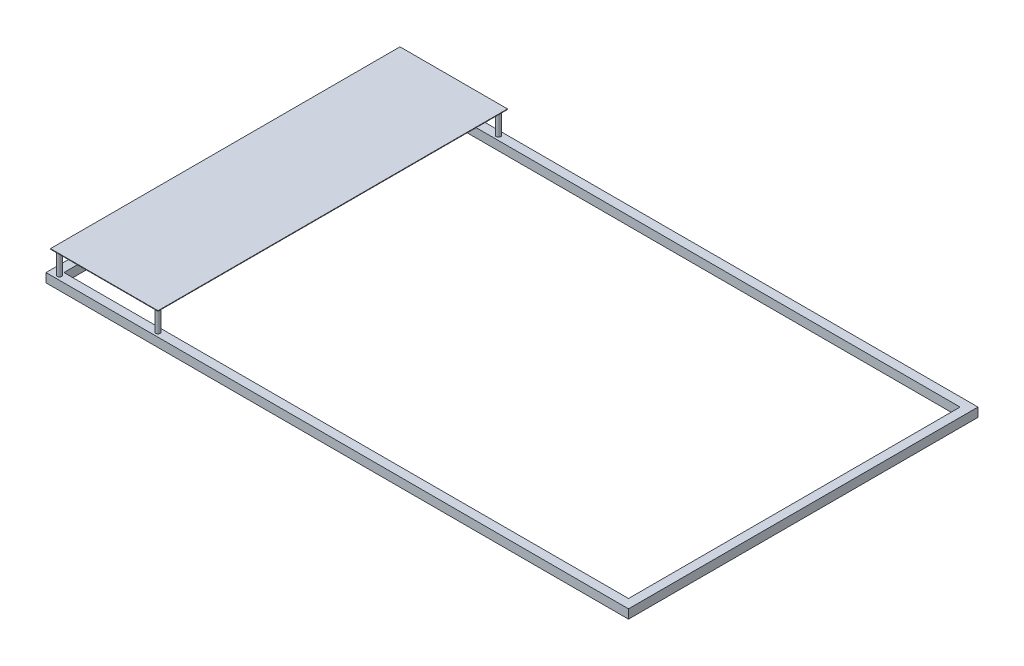
ISO-10303-21;
HEADER;
FILE_DESCRIPTION(('STEP AP214'),'2;1');
FILE_NAME('part.step','',(''),(''),'','','');
FILE_SCHEMA(('AUTOMOTIVE_DESIGN { 1 0 10303 214 1 1 1 1 }'));
ENDSEC;
DATA;
#1=APPLICATION_CONTEXT('core data for automotive mechanical design processes');
#2=APPLICATION_PROTOCOL_DEFINITION('international standard','automotive_design',2000,#1);
#3=PRODUCT_CONTEXT('',#1,'mechanical');
#4=PRODUCT('Part','Part','',(#3));
#5=PRODUCT_RELATED_PRODUCT_CATEGORY('part','',(#4));
#6=PRODUCT_DEFINITION_FORMATION('','',#4);
#7=PRODUCT_DEFINITION_CONTEXT('part definition',#1,'design');
#8=PRODUCT_DEFINITION('design','',#6,#7);
#9=PRODUCT_DEFINITION_SHAPE('','',#8);
#10=(LENGTH_UNIT() NAMED_UNIT(*) SI_UNIT(.MILLI.,.METRE.));
#11=(NAMED_UNIT(*) PLANE_ANGLE_UNIT() SI_UNIT($,.RADIAN.));
#12=(NAMED_UNIT(*) SI_UNIT($,.STERADIAN.) SOLID_ANGLE_UNIT());
#13=UNCERTAINTY_MEASURE_WITH_UNIT(LENGTH_MEASURE(1.E-05),#10,'distance_accuracy_value','');
#14=(GEOMETRIC_REPRESENTATION_CONTEXT(3) GLOBAL_UNCERTAINTY_ASSIGNED_CONTEXT((#13)) GLOBAL_UNIT_ASSIGNED_CONTEXT((#10,
#11,#12)) REPRESENTATION_CONTEXT('',''));
#15=CARTESIAN_POINT('',(0.,0.,0.));
#16=DIRECTION('',(0.,0.,1.));
#17=DIRECTION('',(1.,0.,0.));
#18=AXIS2_PLACEMENT_3D('',#15,#16,#17);
#19=CARTESIAN_POINT('',(-825.5,0.,-495.3));
#20=DIRECTION('',(0.,1.,0.));
#21=DIRECTION('',(1.,0.,0.));
#22=AXIS2_PLACEMENT_3D('',#19,#20,#21);
#23=PLANE('',#22);
#24=DIRECTION('',(1.,0.,0.));
#25=VECTOR('',#24,1.);
#26=CARTESIAN_POINT('',(-1625.6,0.,-965.2));
#27=LINE('',#26,#25);
#28=CARTESIAN_POINT('',(-1625.6,0.,-965.2));
#29=VERTEX_POINT('',#28);
#30=CARTESIAN_POINT('',(-25.4,0.,-965.2));
#31=VERTEX_POINT('',#30);
#32=EDGE_CURVE('E138',#29,#31,#27,.T.);
#33=ORIENTED_EDGE('',*,*,#32,.F.);
#34=DIRECTION('',(0.,0.,-1.));
#35=VECTOR('',#34,1.);
#36=CARTESIAN_POINT('',(-1625.6,0.,-25.4));
#37=LINE('',#36,#35);
#38=CARTESIAN_POINT('',(-1625.6,0.,-25.4));
#39=VERTEX_POINT('',#38);
#40=EDGE_CURVE('E155',#39,#29,#37,.T.);
#41=ORIENTED_EDGE('',*,*,#40,.F.);
#42=DIRECTION('',(-1.,0.,0.));
#43=VECTOR('',#42,1.);
#44=CARTESIAN_POINT('',(-25.4,0.,-25.4));
#45=LINE('',#44,#43);
#46=CARTESIAN_POINT('',(-25.4,0.,-25.4));
#47=VERTEX_POINT('',#46);
#48=EDGE_CURVE('E136',#47,#39,#45,.T.);
#49=ORIENTED_EDGE('',*,*,#48,.F.);
#50=DIRECTION('',(0.,0.,1.));
#51=VECTOR('',#50,1.);
#52=CARTESIAN_POINT('',(-25.4,0.,-965.2));
#53=LINE('',#52,#51);
#54=EDGE_CURVE('E182',#31,#47,#53,.T.);
#55=ORIENTED_EDGE('',*,*,#54,.F.);
#56=EDGE_LOOP('',(#33,#41,#49,#55));
#57=FACE_BOUND('',#56,.T.);
#58=DIRECTION('',(0.,0.,1.));
#59=VECTOR('',#58,1.);
#60=CARTESIAN_POINT('',(-1651.,0.,-990.6));
#61=LINE('',#60,#59);
#62=CARTESIAN_POINT('',(-1651.,0.,-990.6));
#63=VERTEX_POINT('',#62);
#64=CARTESIAN_POINT('',(-1651.,0.,0.));
#65=VERTEX_POINT('',#64);
#66=EDGE_CURVE('E56',#63,#65,#61,.T.);
#67=ORIENTED_EDGE('',*,*,#66,.F.);
#68=DIRECTION('',(-1.,0.,0.));
#69=VECTOR('',#68,1.);
#70=CARTESIAN_POINT('',(0.,0.,-990.6));
#71=LINE('',#70,#69);
#72=CARTESIAN_POINT('',(0.,0.,-990.6));
#73=VERTEX_POINT('',#72);
#74=EDGE_CURVE('E128',#73,#63,#71,.T.);
#75=ORIENTED_EDGE('',*,*,#74,.F.);
#76=DIRECTION('',(0.,0.,-1.));
#77=VECTOR('',#76,1.);
#78=CARTESIAN_POINT('',(0.,0.,0.));
#79=LINE('',#78,#77);
#80=CARTESIAN_POINT('',(0.,0.,0.));
#81=VERTEX_POINT('',#80);
#82=EDGE_CURVE('E142',#81,#73,#79,.T.);
#83=ORIENTED_EDGE('',*,*,#82,.F.);
#84=DIRECTION('',(1.,0.,0.));
#85=VECTOR('',#84,1.);
#86=CARTESIAN_POINT('',(-1651.,0.,0.));
#87=LINE('',#86,#85);
#88=EDGE_CURVE('E145',#65,#81,#87,.T.);
#89=ORIENTED_EDGE('',*,*,#88,.F.);
#90=EDGE_LOOP('',(#67,#75,#83,#89));
#91=FACE_BOUND('',#90,.T.);
#92=ADVANCED_FACE('F46',(#57,#91),#23,.F.);
#93=CARTESIAN_POINT('',(-825.5,25.4,-495.3));
#94=DIRECTION('',(0.,1.,0.));
#95=DIRECTION('',(1.,0.,0.));
#96=AXIS2_PLACEMENT_3D('',#93,#94,#95);
#97=PLANE('',#96);
#98=CARTESIAN_POINT('',(-1625.60000000001,25.4,-12.6999999999999));
#99=DIRECTION('',(0.,1.,0.));
#100=DIRECTION('',(0.,0.,-1.));
#101=AXIS2_PLACEMENT_3D('',#98,#99,#100);
#102=CIRCLE('',#101,6.35000000000019);
#103=CARTESIAN_POINT('',(-1625.60000000001,25.4,-19.0500000000001));
#104=VERTEX_POINT('',#103);
#105=EDGE_CURVE('E210',#104,#104,#102,.T.);
#106=ORIENTED_EDGE('',*,*,#105,.F.);
#107=EDGE_LOOP('',(#106));
#108=FACE_BOUND('',#107,.T.);
#109=CARTESIAN_POINT('',(-1346.20000000001,25.4,-12.6999999999963));
#110=DIRECTION('',(0.,1.,0.));
#111=DIRECTION('',(0.,0.,-1.));
#112=AXIS2_PLACEMENT_3D('',#109,#110,#111);
#113=CIRCLE('',#112,6.35000000000019);
#114=CARTESIAN_POINT('',(-1346.20000000001,25.4,-19.0499999999965));
#115=VERTEX_POINT('',#114);
#116=EDGE_CURVE('E204',#115,#115,#113,.T.);
#117=ORIENTED_EDGE('',*,*,#116,.F.);
#118=EDGE_LOOP('',(#117));
#119=FACE_BOUND('',#118,.T.);
#120=CARTESIAN_POINT('',(-1346.2,25.4,-977.9));
#121=DIRECTION('',(0.,1.,0.));
#122=DIRECTION('',(0.,0.,1.));
#123=AXIS2_PLACEMENT_3D('',#120,#121,#122);
#124=CIRCLE('',#123,6.35000000000015);
#125=CARTESIAN_POINT('',(-1346.2,25.4,-971.55));
#126=VERTEX_POINT('',#125);
#127=EDGE_CURVE('E198',#126,#126,#124,.T.);
#128=ORIENTED_EDGE('',*,*,#127,.F.);
#129=EDGE_LOOP('',(#128));
#130=FACE_BOUND('',#129,.T.);
#131=CARTESIAN_POINT('',(-1625.6,25.4,-977.9));
#132=DIRECTION('',(0.,1.,0.));
#133=DIRECTION('',(0.,0.,1.));
#134=AXIS2_PLACEMENT_3D('',#131,#132,#133);
#135=CIRCLE('',#134,6.35000000000015);
#136=CARTESIAN_POINT('',(-1625.6,25.4,-971.55));
#137=VERTEX_POINT('',#136);
#138=EDGE_CURVE('E176',#137,#137,#135,.T.);
#139=ORIENTED_EDGE('',*,*,#138,.F.);
#140=EDGE_LOOP('',(#139));
#141=FACE_BOUND('',#140,.T.);
#142=DIRECTION('',(1.,0.,0.));
#143=VECTOR('',#142,1.);
#144=CARTESIAN_POINT('',(-1625.6,25.4,-965.2));
#145=LINE('',#144,#143);
#146=CARTESIAN_POINT('',(-1625.6,25.4,-965.2));
#147=VERTEX_POINT('',#146);
#148=CARTESIAN_POINT('',(-25.4,25.4,-965.2));
#149=VERTEX_POINT('',#148);
#150=EDGE_CURVE('E130',#147,#149,#145,.T.);
#151=ORIENTED_EDGE('',*,*,#150,.T.);
#152=DIRECTION('',(0.,0.,1.));
#153=VECTOR('',#152,1.);
#154=CARTESIAN_POINT('',(-25.4,25.4,-965.2));
#155=LINE('',#154,#153);
#156=CARTESIAN_POINT('',(-25.4,25.4,-25.4));
#157=VERTEX_POINT('',#156);
#158=EDGE_CURVE('E50',#149,#157,#155,.T.);
#159=ORIENTED_EDGE('',*,*,#158,.T.);
#160=DIRECTION('',(-1.,0.,0.));
#161=VECTOR('',#160,1.);
#162=CARTESIAN_POINT('',(-25.4,25.4,-25.4));
#163=LINE('',#162,#161);
#164=CARTESIAN_POINT('',(-1625.6,25.4,-25.4));
#165=VERTEX_POINT('',#164);
#166=EDGE_CURVE('E148',#157,#165,#163,.T.);
#167=ORIENTED_EDGE('',*,*,#166,.T.);
#168=DIRECTION('',(0.,0.,-1.));
#169=VECTOR('',#168,1.);
#170=CARTESIAN_POINT('',(-1625.6,25.4,-25.4));
#171=LINE('',#170,#169);
#172=EDGE_CURVE('E137',#165,#147,#171,.T.);
#173=ORIENTED_EDGE('',*,*,#172,.T.);
#174=EDGE_LOOP('',(#151,#159,#167,#173));
#175=FACE_BOUND('',#174,.T.);
#176=DIRECTION('',(-1.,0.,0.));
#177=VECTOR('',#176,1.);
#178=CARTESIAN_POINT('',(0.,25.4,-990.6));
#179=LINE('',#178,#177);
#180=CARTESIAN_POINT('',(0.,25.4,-990.6));
#181=VERTEX_POINT('',#180);
#182=CARTESIAN_POINT('',(-1651.,25.4,-990.6));
#183=VERTEX_POINT('',#182);
#184=EDGE_CURVE('E108',#181,#183,#179,.T.);
#185=ORIENTED_EDGE('',*,*,#184,.T.);
#186=DIRECTION('',(0.,0.,1.));
#187=VECTOR('',#186,1.);
#188=CARTESIAN_POINT('',(-1651.,25.4,-990.6));
#189=LINE('',#188,#187);
#190=CARTESIAN_POINT('',(-1651.,25.4,0.));
#191=VERTEX_POINT('',#190);
#192=EDGE_CURVE('E11',#183,#191,#189,.T.);
#193=ORIENTED_EDGE('',*,*,#192,.T.);
#194=DIRECTION('',(1.,0.,0.));
#195=VECTOR('',#194,1.);
#196=CARTESIAN_POINT('',(-1651.,25.4,0.));
#197=LINE('',#196,#195);
#198=CARTESIAN_POINT('',(0.,25.4,0.));
#199=VERTEX_POINT('',#198);
#200=EDGE_CURVE('E147',#191,#199,#197,.T.);
#201=ORIENTED_EDGE('',*,*,#200,.T.);
#202=DIRECTION('',(0.,0.,-1.));
#203=VECTOR('',#202,1.);
#204=CARTESIAN_POINT('',(0.,25.4,0.));
#205=LINE('',#204,#203);
#206=EDGE_CURVE('E111',#199,#181,#205,.T.);
#207=ORIENTED_EDGE('',*,*,#206,.T.);
#208=EDGE_LOOP('',(#185,#193,#201,#207));
#209=FACE_BOUND('',#208,.T.);
#210=ADVANCED_FACE('F109',(#108,#119,#130,#141,#175,#209),#97,.T.);
#211=CARTESIAN_POINT('',(-1651.,0.,-990.6));
#212=DIRECTION('',(-1.,0.,0.));
#213=DIRECTION('',(0.,0.,1.));
#214=AXIS2_PLACEMENT_3D('',#211,#212,#213);
#215=PLANE('',#214);
#216=ORIENTED_EDGE('',*,*,#66,.T.);
#217=DIRECTION('',(0.,1.,0.));
#218=VECTOR('',#217,1.);
#219=CARTESIAN_POINT('',(-1651.,0.,0.));
#220=LINE('',#219,#218);
#221=EDGE_CURVE('E124',#65,#191,#220,.T.);
#222=ORIENTED_EDGE('',*,*,#221,.T.);
#223=ORIENTED_EDGE('',*,*,#192,.F.);
#224=DIRECTION('',(0.,1.,0.));
#225=VECTOR('',#224,1.);
#226=CARTESIAN_POINT('',(-1651.,0.,-990.6));
#227=LINE('',#226,#225);
#228=EDGE_CURVE('E117',#63,#183,#227,.T.);
#229=ORIENTED_EDGE('',*,*,#228,.F.);
#230=EDGE_LOOP('',(#216,#222,#223,#229));
#231=FACE_BOUND('',#230,.T.);
#232=ADVANCED_FACE('F121',(#231),#215,.T.);
#233=CARTESIAN_POINT('',(-1651.,0.,0.));
#234=DIRECTION('',(0.,0.,1.));
#235=DIRECTION('',(1.,0.,0.));
#236=AXIS2_PLACEMENT_3D('',#233,#234,#235);
#237=PLANE('',#236);
#238=ORIENTED_EDGE('',*,*,#88,.T.);
#239=DIRECTION('',(0.,1.,0.));
#240=VECTOR('',#239,1.);
#241=CARTESIAN_POINT('',(0.,0.,0.));
#242=LINE('',#241,#240);
#243=EDGE_CURVE('E143',#81,#199,#242,.T.);
#244=ORIENTED_EDGE('',*,*,#243,.T.);
#245=ORIENTED_EDGE('',*,*,#200,.F.);
#246=ORIENTED_EDGE('',*,*,#221,.F.);
#247=EDGE_LOOP('',(#238,#244,#245,#246));
#248=FACE_BOUND('',#247,.T.);
#249=ADVANCED_FACE('F308',(#248),#237,.T.);
#250=CARTESIAN_POINT('',(0.,0.,0.));
#251=DIRECTION('',(1.,0.,0.));
#252=DIRECTION('',(0.,1.,0.));
#253=AXIS2_PLACEMENT_3D('',#250,#251,#252);
#254=PLANE('',#253);
#255=ORIENTED_EDGE('',*,*,#82,.T.);
#256=DIRECTION('',(0.,1.,0.));
#257=VECTOR('',#256,1.);
#258=CARTESIAN_POINT('',(0.,0.,-990.6));
#259=LINE('',#258,#257);
#260=EDGE_CURVE('E116',#73,#181,#259,.T.);
#261=ORIENTED_EDGE('',*,*,#260,.T.);
#262=ORIENTED_EDGE('',*,*,#206,.F.);
#263=ORIENTED_EDGE('',*,*,#243,.F.);
#264=EDGE_LOOP('',(#255,#261,#262,#263));
#265=FACE_BOUND('',#264,.T.);
#266=ADVANCED_FACE('F305',(#265),#254,.T.);
#267=CARTESIAN_POINT('',(0.,0.,-990.6));
#268=DIRECTION('',(0.,0.,-1.));
#269=DIRECTION('',(0.,-1.,0.));
#270=AXIS2_PLACEMENT_3D('',#267,#268,#269);
#271=PLANE('',#270);
#272=ORIENTED_EDGE('',*,*,#74,.T.);
#273=ORIENTED_EDGE('',*,*,#228,.T.);
#274=ORIENTED_EDGE('',*,*,#184,.F.);
#275=ORIENTED_EDGE('',*,*,#260,.F.);
#276=EDGE_LOOP('',(#272,#273,#274,#275));
#277=FACE_BOUND('',#276,.T.);
#278=ADVANCED_FACE('F126',(#277),#271,.T.);
#279=CARTESIAN_POINT('',(-1625.6,0.,-965.2));
#280=DIRECTION('',(0.,0.,1.));
#281=DIRECTION('',(1.,0.,0.));
#282=AXIS2_PLACEMENT_3D('',#279,#280,#281);
#283=PLANE('',#282);
#284=ORIENTED_EDGE('',*,*,#32,.T.);
#285=DIRECTION('',(0.,1.,0.));
#286=VECTOR('',#285,1.);
#287=CARTESIAN_POINT('',(-25.4,0.,-965.2));
#288=LINE('',#287,#286);
#289=EDGE_CURVE('E140',#31,#149,#288,.T.);
#290=ORIENTED_EDGE('',*,*,#289,.T.);
#291=ORIENTED_EDGE('',*,*,#150,.F.);
#292=DIRECTION('',(0.,1.,0.));
#293=VECTOR('',#292,1.);
#294=CARTESIAN_POINT('',(-1625.6,0.,-965.2));
#295=LINE('',#294,#293);
#296=EDGE_CURVE('E152',#29,#147,#295,.T.);
#297=ORIENTED_EDGE('',*,*,#296,.F.);
#298=EDGE_LOOP('',(#284,#290,#291,#297));
#299=FACE_BOUND('',#298,.T.);
#300=ADVANCED_FACE('F190',(#299),#283,.T.);
#301=CARTESIAN_POINT('',(-25.4,0.,-965.2));
#302=DIRECTION('',(-1.,0.,0.));
#303=DIRECTION('',(0.,0.,1.));
#304=AXIS2_PLACEMENT_3D('',#301,#302,#303);
#305=PLANE('',#304);
#306=ORIENTED_EDGE('',*,*,#54,.T.);
#307=DIRECTION('',(0.,1.,0.));
#308=VECTOR('',#307,1.);
#309=CARTESIAN_POINT('',(-25.4,0.,-25.4));
#310=LINE('',#309,#308);
#311=EDGE_CURVE('E150',#47,#157,#310,.T.);
#312=ORIENTED_EDGE('',*,*,#311,.T.);
#313=ORIENTED_EDGE('',*,*,#158,.F.);
#314=ORIENTED_EDGE('',*,*,#289,.F.);
#315=EDGE_LOOP('',(#306,#312,#313,#314));
#316=FACE_BOUND('',#315,.T.);
#317=ADVANCED_FACE('F304',(#316),#305,.T.);
#318=CARTESIAN_POINT('',(-25.4,0.,-25.4));
#319=DIRECTION('',(0.,0.,-1.));
#320=DIRECTION('',(0.,-1.,0.));
#321=AXIS2_PLACEMENT_3D('',#318,#319,#320);
#322=PLANE('',#321);
#323=ORIENTED_EDGE('',*,*,#48,.T.);
#324=DIRECTION('',(0.,1.,0.));
#325=VECTOR('',#324,1.);
#326=CARTESIAN_POINT('',(-1625.6,0.,-25.4));
#327=LINE('',#326,#325);
#328=EDGE_CURVE('E133',#39,#165,#327,.T.);
#329=ORIENTED_EDGE('',*,*,#328,.T.);
#330=ORIENTED_EDGE('',*,*,#166,.F.);
#331=ORIENTED_EDGE('',*,*,#311,.F.);
#332=EDGE_LOOP('',(#323,#329,#330,#331));
#333=FACE_BOUND('',#332,.T.);
#334=ADVANCED_FACE('F161',(#333),#322,.T.);
#335=CARTESIAN_POINT('',(-1625.6,0.,-25.4));
#336=DIRECTION('',(1.,0.,0.));
#337=DIRECTION('',(0.,1.,0.));
#338=AXIS2_PLACEMENT_3D('',#335,#336,#337);
#339=PLANE('',#338);
#340=ORIENTED_EDGE('',*,*,#40,.T.);
#341=ORIENTED_EDGE('',*,*,#296,.T.);
#342=ORIENTED_EDGE('',*,*,#172,.F.);
#343=ORIENTED_EDGE('',*,*,#328,.F.);
#344=EDGE_LOOP('',(#340,#341,#342,#343));
#345=FACE_BOUND('',#344,.T.);
#346=ADVANCED_FACE('F48',(#345),#339,.T.);
#347=CARTESIAN_POINT('',(-1625.6,88.9,-977.9));
#348=DIRECTION('',(0.,-1.,0.));
#349=DIRECTION('',(0.,0.,-1.));
#350=AXIS2_PLACEMENT_3D('',#347,#348,#349);
#351=CYLINDRICAL_SURFACE('',#350,6.35000000000015);
#352=CARTESIAN_POINT('',(-1625.6,88.9,-977.9));
#353=DIRECTION('',(0.,1.,0.));
#354=DIRECTION('',(0.,0.,1.));
#355=AXIS2_PLACEMENT_3D('',#352,#353,#354);
#356=CIRCLE('',#355,6.35000000000015);
#357=CARTESIAN_POINT('',(-1625.6,88.9,-971.55));
#358=VERTEX_POINT('',#357);
#359=EDGE_CURVE('E173',#358,#358,#356,.T.);
#360=ORIENTED_EDGE('',*,*,#359,.F.);
#361=EDGE_LOOP('',(#360));
#362=FACE_BOUND('',#361,.T.);
#363=ORIENTED_EDGE('',*,*,#138,.T.);
#364=EDGE_LOOP('',(#363));
#365=FACE_BOUND('',#364,.T.);
#366=ADVANCED_FACE('F299',(#362,#365),#351,.T.);
#367=CARTESIAN_POINT('',(-1346.2,88.9,-977.9));
#368=DIRECTION('',(0.,-1.,0.));
#369=DIRECTION('',(0.,0.,-1.));
#370=AXIS2_PLACEMENT_3D('',#367,#368,#369);
#371=CYLINDRICAL_SURFACE('',#370,6.35000000000015);
#372=CARTESIAN_POINT('',(-1346.2,88.9,-977.9));
#373=DIRECTION('',(0.,1.,0.));
#374=DIRECTION('',(0.,0.,1.));
#375=AXIS2_PLACEMENT_3D('',#372,#373,#374);
#376=CIRCLE('',#375,6.35000000000015);
#377=CARTESIAN_POINT('',(-1346.2,88.9,-971.55));
#378=VERTEX_POINT('',#377);
#379=EDGE_CURVE('E196',#378,#378,#376,.T.);
#380=ORIENTED_EDGE('',*,*,#379,.F.);
#381=EDGE_LOOP('',(#380));
#382=FACE_BOUND('',#381,.T.);
#383=ORIENTED_EDGE('',*,*,#127,.T.);
#384=EDGE_LOOP('',(#383));
#385=FACE_BOUND('',#384,.T.);
#386=ADVANCED_FACE('F349',(#382,#385),#371,.T.);
#387=CARTESIAN_POINT('',(-1346.20000000001,88.9,-12.6999999999963));
#388=DIRECTION('',(0.,-1.,0.));
#389=DIRECTION('',(0.,0.,-1.));
#390=AXIS2_PLACEMENT_3D('',#387,#388,#389);
#391=CYLINDRICAL_SURFACE('',#390,6.35000000000019);
#392=CARTESIAN_POINT('',(-1346.20000000001,88.9,-12.6999999999963));
#393=DIRECTION('',(0.,1.,0.));
#394=DIRECTION('',(0.,0.,-1.));
#395=AXIS2_PLACEMENT_3D('',#392,#393,#394);
#396=CIRCLE('',#395,6.35000000000019);
#397=CARTESIAN_POINT('',(-1346.20000000001,88.9,-19.0499999999965));
#398=VERTEX_POINT('',#397);
#399=EDGE_CURVE('E201',#398,#398,#396,.T.);
#400=ORIENTED_EDGE('',*,*,#399,.F.);
#401=EDGE_LOOP('',(#400));
#402=FACE_BOUND('',#401,.T.);
#403=ORIENTED_EDGE('',*,*,#116,.T.);
#404=EDGE_LOOP('',(#403));
#405=FACE_BOUND('',#404,.T.);
#406=ADVANCED_FACE('F356',(#402,#405),#391,.T.);
#407=CARTESIAN_POINT('',(-1625.60000000001,88.9,-12.6999999999999));
#408=DIRECTION('',(0.,-1.,0.));
#409=DIRECTION('',(0.,0.,-1.));
#410=AXIS2_PLACEMENT_3D('',#407,#408,#409);
#411=CYLINDRICAL_SURFACE('',#410,6.35000000000019);
#412=CARTESIAN_POINT('',(-1625.60000000001,88.9,-12.6999999999999));
#413=DIRECTION('',(0.,1.,0.));
#414=DIRECTION('',(0.,0.,-1.));
#415=AXIS2_PLACEMENT_3D('',#412,#413,#414);
#416=CIRCLE('',#415,6.35000000000019);
#417=CARTESIAN_POINT('',(-1625.60000000001,88.9,-19.0500000000001));
#418=VERTEX_POINT('',#417);
#419=EDGE_CURVE('E207',#418,#418,#416,.T.);
#420=ORIENTED_EDGE('',*,*,#419,.F.);
#421=EDGE_LOOP('',(#420));
#422=FACE_BOUND('',#421,.T.);
#423=ORIENTED_EDGE('',*,*,#105,.T.);
#424=EDGE_LOOP('',(#423));
#425=FACE_BOUND('',#424,.T.);
#426=ADVANCED_FACE('F363',(#422,#425),#411,.T.);
#427=CARTESIAN_POINT('',(-1638.3,90.4875,-990.6));
#428=DIRECTION('',(1.,0.,0.));
#429=DIRECTION('',(0.,0.,-1.));
#430=AXIS2_PLACEMENT_3D('',#427,#428,#429);
#431=PLANE('',#430);
#432=DIRECTION('',(0.,0.,1.));
#433=VECTOR('',#432,1.);
#434=CARTESIAN_POINT('',(-1638.3,88.9,-990.6));
#435=LINE('',#434,#433);
#436=CARTESIAN_POINT('',(-1638.3,88.9,-990.6));
#437=VERTEX_POINT('',#436);
#438=CARTESIAN_POINT('',(-1638.3,88.9,-1.11022302462516E-13));
#439=VERTEX_POINT('',#438);
#440=EDGE_CURVE('E238',#437,#439,#435,.T.);
#441=ORIENTED_EDGE('',*,*,#440,.T.);
#442=DIRECTION('',(0.,-1.,0.));
#443=VECTOR('',#442,1.);
#444=CARTESIAN_POINT('',(-1638.3,90.4875,-1.11022302462516E-13));
#445=LINE('',#444,#443);
#446=CARTESIAN_POINT('',(-1638.3,90.4875,-1.11022302462516E-13));
#447=VERTEX_POINT('',#446);
#448=EDGE_CURVE('E213',#447,#439,#445,.T.);
#449=ORIENTED_EDGE('',*,*,#448,.F.);
#450=DIRECTION('',(0.,0.,1.));
#451=VECTOR('',#450,1.);
#452=CARTESIAN_POINT('',(-1638.3,90.4875,-990.6));
#453=LINE('',#452,#451);
#454=CARTESIAN_POINT('',(-1638.3,90.4875,-990.6));
#455=VERTEX_POINT('',#454);
#456=EDGE_CURVE('E231',#455,#447,#453,.T.);
#457=ORIENTED_EDGE('',*,*,#456,.F.);
#458=DIRECTION('',(0.,-1.,0.));
#459=VECTOR('',#458,1.);
#460=CARTESIAN_POINT('',(-1638.3,90.4875,-990.6));
#461=LINE('',#460,#459);
#462=EDGE_CURVE('E224',#455,#437,#461,.T.);
#463=ORIENTED_EDGE('',*,*,#462,.T.);
#464=EDGE_LOOP('',(#441,#449,#457,#463));
#465=FACE_BOUND('',#464,.T.);
#466=ADVANCED_FACE('F262',(#465),#431,.F.);
#467=CARTESIAN_POINT('',(-1638.3,90.4875,-1.11022302462516E-13));
#468=DIRECTION('',(0.,0.,-1.));
#469=DIRECTION('',(-1.,0.,0.));
#470=AXIS2_PLACEMENT_3D('',#467,#468,#469);
#471=PLANE('',#470);
#472=DIRECTION('',(1.,0.,0.));
#473=VECTOR('',#472,1.);
#474=CARTESIAN_POINT('',(-1638.3,88.9,-1.11022302462516E-13));
#475=LINE('',#474,#473);
#476=CARTESIAN_POINT('',(-1333.5,88.9,-1.11022302462516E-13));
#477=VERTEX_POINT('',#476);
#478=EDGE_CURVE('E235',#439,#477,#475,.T.);
#479=ORIENTED_EDGE('',*,*,#478,.T.);
#480=DIRECTION('',(0.,-1.,0.));
#481=VECTOR('',#480,1.);
#482=CARTESIAN_POINT('',(-1333.5,90.4875,-1.11022302462516E-13));
#483=LINE('',#482,#481);
#484=CARTESIAN_POINT('',(-1333.5,90.4875,-1.11022302462516E-13));
#485=VERTEX_POINT('',#484);
#486=EDGE_CURVE('E218',#485,#477,#483,.T.);
#487=ORIENTED_EDGE('',*,*,#486,.F.);
#488=DIRECTION('',(1.,0.,0.));
#489=VECTOR('',#488,1.);
#490=CARTESIAN_POINT('',(-1638.3,90.4875,-1.11022302462516E-13));
#491=LINE('',#490,#489);
#492=EDGE_CURVE('E246',#447,#485,#491,.T.);
#493=ORIENTED_EDGE('',*,*,#492,.F.);
#494=ORIENTED_EDGE('',*,*,#448,.T.);
#495=EDGE_LOOP('',(#479,#487,#493,#494));
#496=FACE_BOUND('',#495,.T.);
#497=ADVANCED_FACE('F266',(#496),#471,.F.);
#498=CARTESIAN_POINT('',(-1333.5,90.4875,-990.6));
#499=DIRECTION('',(-1.,0.,0.));
#500=DIRECTION('',(0.,0.,1.));
#501=AXIS2_PLACEMENT_3D('',#498,#499,#500);
#502=PLANE('',#501);
#503=DIRECTION('',(0.,0.,-1.));
#504=VECTOR('',#503,1.);
#505=CARTESIAN_POINT('',(-1333.5,88.9,-990.6));
#506=LINE('',#505,#504);
#507=CARTESIAN_POINT('',(-1333.5,88.9,-990.6));
#508=VERTEX_POINT('',#507);
#509=EDGE_CURVE('E232',#477,#508,#506,.T.);
#510=ORIENTED_EDGE('',*,*,#509,.T.);
#511=DIRECTION('',(0.,-1.,0.));
#512=VECTOR('',#511,1.);
#513=CARTESIAN_POINT('',(-1333.5,90.4875,-990.6));
#514=LINE('',#513,#512);
#515=CARTESIAN_POINT('',(-1333.5,90.4875,-990.6));
#516=VERTEX_POINT('',#515);
#517=EDGE_CURVE('E221',#516,#508,#514,.T.);
#518=ORIENTED_EDGE('',*,*,#517,.F.);
#519=DIRECTION('',(0.,0.,-1.));
#520=VECTOR('',#519,1.);
#521=CARTESIAN_POINT('',(-1333.5,90.4875,-990.6));
#522=LINE('',#521,#520);
#523=EDGE_CURVE('E243',#485,#516,#522,.T.);
#524=ORIENTED_EDGE('',*,*,#523,.F.);
#525=ORIENTED_EDGE('',*,*,#486,.T.);
#526=EDGE_LOOP('',(#510,#518,#524,#525));
#527=FACE_BOUND('',#526,.T.);
#528=ADVANCED_FACE('F384',(#527),#502,.F.);
#529=CARTESIAN_POINT('',(-1638.3,90.4875,-990.6));
#530=DIRECTION('',(0.,0.,1.));
#531=DIRECTION('',(1.,0.,0.));
#532=AXIS2_PLACEMENT_3D('',#529,#530,#531);
#533=PLANE('',#532);
#534=DIRECTION('',(-1.,0.,0.));
#535=VECTOR('',#534,1.);
#536=CARTESIAN_POINT('',(-1638.3,88.9,-990.6));
#537=LINE('',#536,#535);
#538=EDGE_CURVE('E228',#508,#437,#537,.T.);
#539=ORIENTED_EDGE('',*,*,#538,.T.);
#540=ORIENTED_EDGE('',*,*,#462,.F.);
#541=DIRECTION('',(-1.,0.,0.));
#542=VECTOR('',#541,1.);
#543=CARTESIAN_POINT('',(-1638.3,90.4875,-990.6));
#544=LINE('',#543,#542);
#545=EDGE_CURVE('E227',#516,#455,#544,.T.);
#546=ORIENTED_EDGE('',*,*,#545,.F.);
#547=ORIENTED_EDGE('',*,*,#517,.T.);
#548=EDGE_LOOP('',(#539,#540,#546,#547));
#549=FACE_BOUND('',#548,.T.);
#550=ADVANCED_FACE('F280',(#549),#533,.F.);
#551=CARTESIAN_POINT('',(0.,90.4875,0.));
#552=DIRECTION('',(0.,1.,0.));
#553=DIRECTION('',(0.,0.,1.));
#554=AXIS2_PLACEMENT_3D('',#551,#552,#553);
#555=PLANE('',#554);
#556=ORIENTED_EDGE('',*,*,#456,.T.);
#557=ORIENTED_EDGE('',*,*,#492,.T.);
#558=ORIENTED_EDGE('',*,*,#523,.T.);
#559=ORIENTED_EDGE('',*,*,#545,.T.);
#560=EDGE_LOOP('',(#556,#557,#558,#559));
#561=FACE_BOUND('',#560,.T.);
#562=ADVANCED_FACE('F254',(#561),#555,.T.);
#563=CARTESIAN_POINT('',(0.,88.9,0.));
#564=DIRECTION('',(0.,1.,0.));
#565=DIRECTION('',(0.,0.,1.));
#566=AXIS2_PLACEMENT_3D('',#563,#564,#565);
#567=PLANE('',#566);
#568=ORIENTED_EDGE('',*,*,#359,.T.);
#569=EDGE_LOOP('',(#568));
#570=FACE_BOUND('',#569,.T.);
#571=ORIENTED_EDGE('',*,*,#379,.T.);
#572=EDGE_LOOP('',(#571));
#573=FACE_BOUND('',#572,.T.);
#574=ORIENTED_EDGE('',*,*,#399,.T.);
#575=EDGE_LOOP('',(#574));
#576=FACE_BOUND('',#575,.T.);
#577=ORIENTED_EDGE('',*,*,#419,.T.);
#578=EDGE_LOOP('',(#577));
#579=FACE_BOUND('',#578,.T.);
#580=ORIENTED_EDGE('',*,*,#440,.F.);
#581=ORIENTED_EDGE('',*,*,#538,.F.);
#582=ORIENTED_EDGE('',*,*,#509,.F.);
#583=ORIENTED_EDGE('',*,*,#478,.F.);
#584=EDGE_LOOP('',(#580,#581,#582,#583));
#585=FACE_BOUND('',#584,.T.);
#586=ADVANCED_FACE('F281',(#570,#573,#576,#579,#585),#567,.F.);
#587=CLOSED_SHELL('',(#92,#210,#232,#249,#266,#278,#300,#317,#334,#346,#366,#386,#406,#426,#466,
#497,#528,#550,#562,#586));
#588=MANIFOLD_SOLID_BREP('B2',#587);
#589=ADVANCED_BREP_SHAPE_REPRESENTATION('',(#18,#588),#14);
#590=SHAPE_DEFINITION_REPRESENTATION(#9,#589);
ENDSEC;
END-ISO-10303-21;
